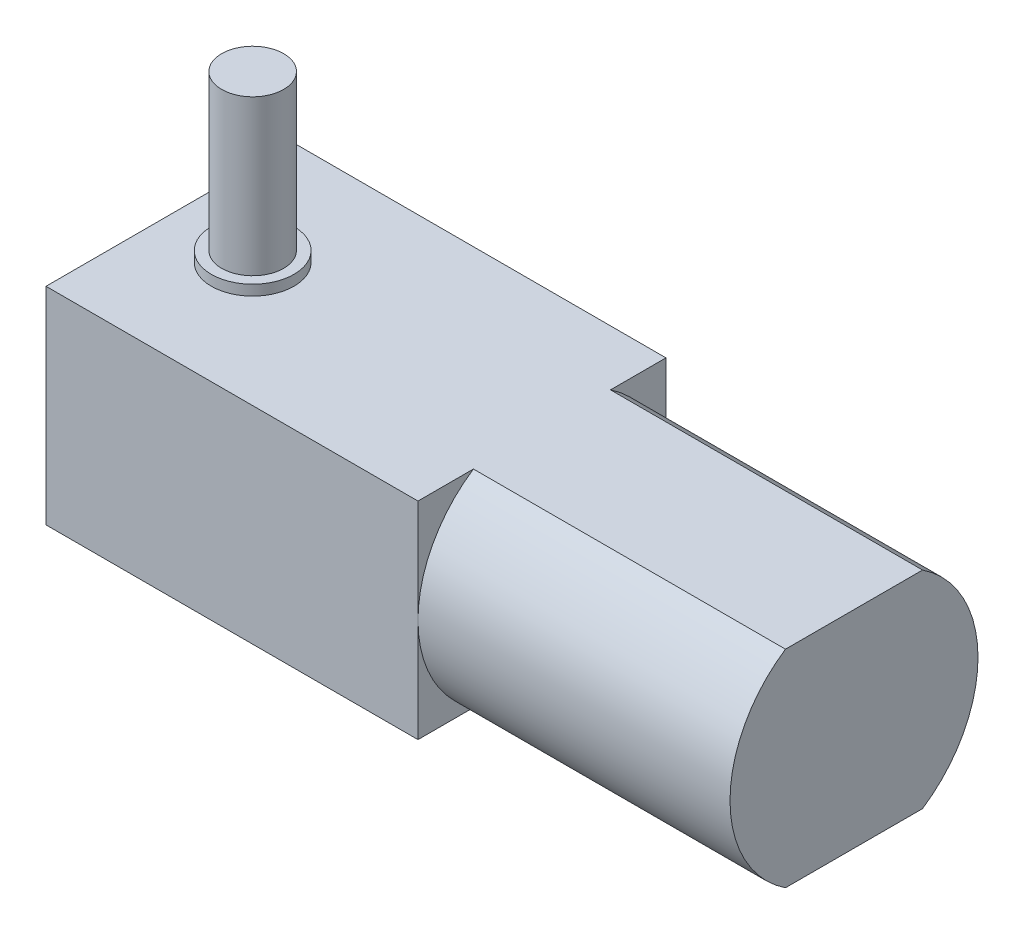
ISO-10303-21;
HEADER;
FILE_DESCRIPTION(('STEP AP214'),'2;1');
FILE_NAME('part.step','',(''),(''),'','','');
FILE_SCHEMA(('AUTOMOTIVE_DESIGN { 1 0 10303 214 1 1 1 1 }'));
ENDSEC;
DATA;
#1=APPLICATION_CONTEXT('core data for automotive mechanical design processes');
#2=APPLICATION_PROTOCOL_DEFINITION('international standard','automotive_design',2000,#1);
#3=PRODUCT_CONTEXT('',#1,'mechanical');
#4=PRODUCT('Part','Part','',(#3));
#5=PRODUCT_RELATED_PRODUCT_CATEGORY('part','',(#4));
#6=PRODUCT_DEFINITION_FORMATION('','',#4);
#7=PRODUCT_DEFINITION_CONTEXT('part definition',#1,'design');
#8=PRODUCT_DEFINITION('design','',#6,#7);
#9=PRODUCT_DEFINITION_SHAPE('','',#8);
#10=(LENGTH_UNIT() NAMED_UNIT(*) SI_UNIT(.MILLI.,.METRE.));
#11=(NAMED_UNIT(*) PLANE_ANGLE_UNIT() SI_UNIT($,.RADIAN.));
#12=(NAMED_UNIT(*) SI_UNIT($,.STERADIAN.) SOLID_ANGLE_UNIT());
#13=UNCERTAINTY_MEASURE_WITH_UNIT(LENGTH_MEASURE(1.E-05),#10,'distance_accuracy_value','');
#14=(GEOMETRIC_REPRESENTATION_CONTEXT(3) GLOBAL_UNCERTAINTY_ASSIGNED_CONTEXT((#13)) GLOBAL_UNIT_ASSIGNED_CONTEXT((#10,
#11,#12)) REPRESENTATION_CONTEXT('',''));
#15=CARTESIAN_POINT('',(0.,0.,0.));
#16=DIRECTION('',(0.,0.,1.));
#17=DIRECTION('',(1.,0.,0.));
#18=AXIS2_PLACEMENT_3D('',#15,#16,#17);
#19=CARTESIAN_POINT('',(15.1,5.,0.));
#20=DIRECTION('',(0.,1.,0.));
#21=DIRECTION('',(0.,0.,1.));
#22=AXIS2_PLACEMENT_3D('',#19,#20,#21);
#23=PLANE('',#22);
#24=DIRECTION('',(-1.,0.,0.));
#25=VECTOR('',#24,1.);
#26=CARTESIAN_POINT('',(15.1,5.,-3.3166247903554));
#27=LINE('',#26,#25);
#28=CARTESIAN_POINT('',(15.1,5.,-3.3166247903554));
#29=VERTEX_POINT('',#28);
#30=CARTESIAN_POINT('',(0.,5.,-3.3166247903554));
#31=VERTEX_POINT('',#30);
#32=EDGE_CURVE('E171',#29,#31,#27,.T.);
#33=ORIENTED_EDGE('',*,*,#32,.T.);
#34=DIRECTION('',(0.,0.,-1.));
#35=VECTOR('',#34,1.);
#36=CARTESIAN_POINT('',(0.,5.,0.));
#37=LINE('',#36,#35);
#38=CARTESIAN_POINT('',(0.,5.,-6.));
#39=VERTEX_POINT('',#38);
#40=EDGE_CURVE('E135',#31,#39,#37,.T.);
#41=ORIENTED_EDGE('',*,*,#40,.T.);
#42=DIRECTION('',(1.,0.,0.));
#43=VECTOR('',#42,1.);
#44=CARTESIAN_POINT('',(-18.,5.,-6.));
#45=LINE('',#44,#43);
#46=CARTESIAN_POINT('',(-18.,5.,-6.));
#47=VERTEX_POINT('',#46);
#48=EDGE_CURVE('E155',#47,#39,#45,.T.);
#49=ORIENTED_EDGE('',*,*,#48,.F.);
#50=DIRECTION('',(0.,0.,-1.));
#51=VECTOR('',#50,1.);
#52=CARTESIAN_POINT('',(-18.,5.,0.));
#53=LINE('',#52,#51);
#54=CARTESIAN_POINT('',(-18.,5.,6.));
#55=VERTEX_POINT('',#54);
#56=EDGE_CURVE('E118',#55,#47,#53,.T.);
#57=ORIENTED_EDGE('',*,*,#56,.F.);
#58=DIRECTION('',(1.,0.,0.));
#59=VECTOR('',#58,1.);
#60=CARTESIAN_POINT('',(-18.,5.,6.));
#61=LINE('',#60,#59);
#62=CARTESIAN_POINT('',(0.,5.,6.));
#63=VERTEX_POINT('',#62);
#64=EDGE_CURVE('E130',#55,#63,#61,.T.);
#65=ORIENTED_EDGE('',*,*,#64,.T.);
#66=CARTESIAN_POINT('',(0.,5.,3.3166247903554));
#67=VERTEX_POINT('',#66);
#68=EDGE_CURVE('E132',#63,#67,#37,.T.);
#69=ORIENTED_EDGE('',*,*,#68,.T.);
#70=DIRECTION('',(-1.,0.,0.));
#71=VECTOR('',#70,1.);
#72=CARTESIAN_POINT('',(15.1,5.,3.3166247903554));
#73=LINE('',#72,#71);
#74=CARTESIAN_POINT('',(15.1,5.,3.3166247903554));
#75=VERTEX_POINT('',#74);
#76=EDGE_CURVE('E11',#75,#67,#73,.T.);
#77=ORIENTED_EDGE('',*,*,#76,.F.);
#78=DIRECTION('',(0.,0.,-1.));
#79=VECTOR('',#78,1.);
#80=CARTESIAN_POINT('',(15.1,5.,0.));
#81=LINE('',#80,#79);
#82=EDGE_CURVE('E159',#75,#29,#81,.T.);
#83=ORIENTED_EDGE('',*,*,#82,.T.);
#84=EDGE_LOOP('',(#33,#41,#49,#57,#65,#69,#77,#83));
#85=FACE_BOUND('',#84,.T.);
#86=CARTESIAN_POINT('',(-14.,5.,0.));
#87=DIRECTION('',(0.,1.,0.));
#88=DIRECTION('',(0.,0.,1.));
#89=AXIS2_PLACEMENT_3D('',#86,#87,#88);
#90=CIRCLE('',#89,2.);
#91=CARTESIAN_POINT('',(-14.,5.,2.));
#92=VERTEX_POINT('',#91);
#93=EDGE_CURVE('E333',#92,#92,#90,.T.);
#94=ORIENTED_EDGE('',*,*,#93,.F.);
#95=EDGE_LOOP('',(#94));
#96=FACE_BOUND('',#95,.T.);
#97=ADVANCED_FACE('F39',(#85,#96),#23,.T.);
#98=CARTESIAN_POINT('',(15.1,0.,0.));
#99=DIRECTION('',(-1.,0.,0.));
#100=DIRECTION('',(0.,0.,1.));
#101=AXIS2_PLACEMENT_3D('',#98,#99,#100);
#102=CYLINDRICAL_SURFACE('',#101,6.);
#103=CARTESIAN_POINT('',(0.,0.,0.));
#104=DIRECTION('',(1.,0.,0.));
#105=DIRECTION('',(0.,0.,-1.));
#106=AXIS2_PLACEMENT_3D('',#103,#104,#105);
#107=CIRCLE('',#106,6.);
#108=CARTESIAN_POINT('',(0.,0.,6.));
#109=VERTEX_POINT('',#108);
#110=EDGE_CURVE('E167',#67,#109,#107,.T.);
#111=ORIENTED_EDGE('',*,*,#110,.T.);
#112=CARTESIAN_POINT('',(0.,-5.,3.3166247903554));
#113=VERTEX_POINT('',#112);
#114=EDGE_CURVE('E154',#109,#113,#107,.T.);
#115=ORIENTED_EDGE('',*,*,#114,.T.);
#116=DIRECTION('',(-1.,0.,0.));
#117=VECTOR('',#116,1.);
#118=CARTESIAN_POINT('',(15.1,-5.,3.3166247903554));
#119=LINE('',#118,#117);
#120=CARTESIAN_POINT('',(15.1,-5.,3.3166247903554));
#121=VERTEX_POINT('',#120);
#122=EDGE_CURVE('E47',#121,#113,#119,.T.);
#123=ORIENTED_EDGE('',*,*,#122,.F.);
#124=CARTESIAN_POINT('',(15.1,0.,0.));
#125=DIRECTION('',(1.,0.,0.));
#126=DIRECTION('',(0.,0.,-1.));
#127=AXIS2_PLACEMENT_3D('',#124,#125,#126);
#128=CIRCLE('',#127,6.);
#129=EDGE_CURVE('E162',#75,#121,#128,.T.);
#130=ORIENTED_EDGE('',*,*,#129,.F.);
#131=ORIENTED_EDGE('',*,*,#76,.T.);
#132=EDGE_LOOP('',(#111,#115,#123,#130,#131));
#133=FACE_BOUND('',#132,.T.);
#134=ADVANCED_FACE('F182',(#133),#102,.T.);
#135=CARTESIAN_POINT('',(15.1,-5.,0.));
#136=DIRECTION('',(0.,1.,0.));
#137=DIRECTION('',(0.,0.,1.));
#138=AXIS2_PLACEMENT_3D('',#135,#136,#137);
#139=PLANE('',#138);
#140=ORIENTED_EDGE('',*,*,#122,.T.);
#141=DIRECTION('',(0.,0.,-1.));
#142=VECTOR('',#141,1.);
#143=CARTESIAN_POINT('',(0.,-5.,0.));
#144=LINE('',#143,#142);
#145=CARTESIAN_POINT('',(0.,-5.,6.));
#146=VERTEX_POINT('',#145);
#147=EDGE_CURVE('E113',#146,#113,#144,.T.);
#148=ORIENTED_EDGE('',*,*,#147,.F.);
#149=DIRECTION('',(1.,0.,0.));
#150=VECTOR('',#149,1.);
#151=CARTESIAN_POINT('',(-18.,-5.,6.));
#152=LINE('',#151,#150);
#153=CARTESIAN_POINT('',(-18.,-5.,6.));
#154=VERTEX_POINT('',#153);
#155=EDGE_CURVE('E106',#154,#146,#152,.T.);
#156=ORIENTED_EDGE('',*,*,#155,.F.);
#157=DIRECTION('',(0.,0.,-1.));
#158=VECTOR('',#157,1.);
#159=CARTESIAN_POINT('',(-18.,-5.,0.));
#160=LINE('',#159,#158);
#161=CARTESIAN_POINT('',(-18.,-5.,-6.));
#162=VERTEX_POINT('',#161);
#163=EDGE_CURVE('E111',#154,#162,#160,.T.);
#164=ORIENTED_EDGE('',*,*,#163,.T.);
#165=DIRECTION('',(1.,0.,0.));
#166=VECTOR('',#165,1.);
#167=CARTESIAN_POINT('',(-18.,-5.,-6.));
#168=LINE('',#167,#166);
#169=CARTESIAN_POINT('',(0.,-5.,-6.));
#170=VERTEX_POINT('',#169);
#171=EDGE_CURVE('E117',#162,#170,#168,.T.);
#172=ORIENTED_EDGE('',*,*,#171,.T.);
#173=CARTESIAN_POINT('',(0.,-5.,-3.3166247903554));
#174=VERTEX_POINT('',#173);
#175=EDGE_CURVE('E146',#174,#170,#144,.T.);
#176=ORIENTED_EDGE('',*,*,#175,.F.);
#177=DIRECTION('',(-1.,0.,0.));
#178=VECTOR('',#177,1.);
#179=CARTESIAN_POINT('',(15.1,-5.,-3.3166247903554));
#180=LINE('',#179,#178);
#181=CARTESIAN_POINT('',(15.1,-5.,-3.3166247903554));
#182=VERTEX_POINT('',#181);
#183=EDGE_CURVE('E174',#182,#174,#180,.T.);
#184=ORIENTED_EDGE('',*,*,#183,.F.);
#185=DIRECTION('',(0.,0.,-1.));
#186=VECTOR('',#185,1.);
#187=CARTESIAN_POINT('',(15.1,-5.,0.));
#188=LINE('',#187,#186);
#189=EDGE_CURVE('E165',#121,#182,#188,.T.);
#190=ORIENTED_EDGE('',*,*,#189,.F.);
#191=EDGE_LOOP('',(#140,#148,#156,#164,#172,#176,#184,#190));
#192=FACE_BOUND('',#191,.T.);
#193=ADVANCED_FACE('F109',(#192),#139,.F.);
#194=CARTESIAN_POINT('',(0.,0.,-6.));
#195=VERTEX_POINT('',#194);
#196=EDGE_CURVE('E163',#174,#195,#107,.T.);
#197=ORIENTED_EDGE('',*,*,#196,.T.);
#198=EDGE_CURVE('E170',#195,#31,#107,.T.);
#199=ORIENTED_EDGE('',*,*,#198,.T.);
#200=ORIENTED_EDGE('',*,*,#32,.F.);
#201=EDGE_CURVE('E54',#182,#29,#128,.T.);
#202=ORIENTED_EDGE('',*,*,#201,.F.);
#203=ORIENTED_EDGE('',*,*,#183,.T.);
#204=EDGE_LOOP('',(#197,#199,#200,#202,#203));
#205=FACE_BOUND('',#204,.T.);
#206=ADVANCED_FACE('F187',(#205),#102,.T.);
#207=CARTESIAN_POINT('',(15.1,0.,0.));
#208=DIRECTION('',(1.,0.,0.));
#209=DIRECTION('',(0.,0.,-1.));
#210=AXIS2_PLACEMENT_3D('',#207,#208,#209);
#211=PLANE('',#210);
#212=ORIENTED_EDGE('',*,*,#82,.F.);
#213=ORIENTED_EDGE('',*,*,#129,.T.);
#214=ORIENTED_EDGE('',*,*,#189,.T.);
#215=ORIENTED_EDGE('',*,*,#201,.T.);
#216=EDGE_LOOP('',(#212,#213,#214,#215));
#217=FACE_BOUND('',#216,.T.);
#218=ADVANCED_FACE('F201',(#217),#211,.T.);
#219=CARTESIAN_POINT('',(0.,0.,0.));
#220=DIRECTION('',(1.,0.,0.));
#221=DIRECTION('',(0.,0.,-1.));
#222=AXIS2_PLACEMENT_3D('',#219,#220,#221);
#223=PLANE('',#222);
#224=ORIENTED_EDGE('',*,*,#196,.F.);
#225=ORIENTED_EDGE('',*,*,#175,.T.);
#226=DIRECTION('',(0.,-1.,0.));
#227=VECTOR('',#226,1.);
#228=CARTESIAN_POINT('',(0.,0.,-6.));
#229=LINE('',#228,#227);
#230=EDGE_CURVE('E149',#195,#170,#229,.T.);
#231=ORIENTED_EDGE('',*,*,#230,.F.);
#232=EDGE_LOOP('',(#224,#225,#231));
#233=FACE_BOUND('',#232,.T.);
#234=ADVANCED_FACE('F192',(#233),#223,.T.);
#235=ORIENTED_EDGE('',*,*,#198,.F.);
#236=EDGE_CURVE('E150',#39,#195,#229,.T.);
#237=ORIENTED_EDGE('',*,*,#236,.F.);
#238=ORIENTED_EDGE('',*,*,#40,.F.);
#239=EDGE_LOOP('',(#235,#237,#238));
#240=FACE_BOUND('',#239,.T.);
#241=ADVANCED_FACE('F198',(#240),#223,.T.);
#242=ORIENTED_EDGE('',*,*,#110,.F.);
#243=ORIENTED_EDGE('',*,*,#68,.F.);
#244=DIRECTION('',(0.,-1.,0.));
#245=VECTOR('',#244,1.);
#246=CARTESIAN_POINT('',(0.,0.,6.));
#247=LINE('',#246,#245);
#248=EDGE_CURVE('E143',#63,#109,#247,.T.);
#249=ORIENTED_EDGE('',*,*,#248,.T.);
#250=EDGE_LOOP('',(#242,#243,#249));
#251=FACE_BOUND('',#250,.T.);
#252=ADVANCED_FACE('F242',(#251),#223,.T.);
#253=ORIENTED_EDGE('',*,*,#114,.F.);
#254=EDGE_CURVE('E147',#109,#146,#247,.T.);
#255=ORIENTED_EDGE('',*,*,#254,.T.);
#256=ORIENTED_EDGE('',*,*,#147,.T.);
#257=EDGE_LOOP('',(#253,#255,#256));
#258=FACE_BOUND('',#257,.T.);
#259=ADVANCED_FACE('F209',(#258),#223,.T.);
#260=CARTESIAN_POINT('',(-18.,0.,6.));
#261=DIRECTION('',(0.,0.,1.));
#262=DIRECTION('',(1.,0.,0.));
#263=AXIS2_PLACEMENT_3D('',#260,#261,#262);
#264=PLANE('',#263);
#265=ORIENTED_EDGE('',*,*,#248,.F.);
#266=ORIENTED_EDGE('',*,*,#64,.F.);
#267=DIRECTION('',(0.,-1.,0.));
#268=VECTOR('',#267,1.);
#269=CARTESIAN_POINT('',(-18.,0.,6.));
#270=LINE('',#269,#268);
#271=EDGE_CURVE('E123',#55,#154,#270,.T.);
#272=ORIENTED_EDGE('',*,*,#271,.T.);
#273=ORIENTED_EDGE('',*,*,#155,.T.);
#274=ORIENTED_EDGE('',*,*,#254,.F.);
#275=EDGE_LOOP('',(#265,#266,#272,#273,#274));
#276=FACE_BOUND('',#275,.T.);
#277=ADVANCED_FACE('F129',(#276),#264,.T.);
#278=CARTESIAN_POINT('',(-18.,0.,-6.));
#279=DIRECTION('',(0.,0.,1.));
#280=DIRECTION('',(1.,0.,0.));
#281=AXIS2_PLACEMENT_3D('',#278,#279,#280);
#282=PLANE('',#281);
#283=ORIENTED_EDGE('',*,*,#236,.T.);
#284=ORIENTED_EDGE('',*,*,#230,.T.);
#285=ORIENTED_EDGE('',*,*,#171,.F.);
#286=DIRECTION('',(0.,-1.,0.));
#287=VECTOR('',#286,1.);
#288=CARTESIAN_POINT('',(-18.,0.,-6.));
#289=LINE('',#288,#287);
#290=EDGE_CURVE('E125',#47,#162,#289,.T.);
#291=ORIENTED_EDGE('',*,*,#290,.F.);
#292=ORIENTED_EDGE('',*,*,#48,.T.);
#293=EDGE_LOOP('',(#283,#284,#285,#291,#292));
#294=FACE_BOUND('',#293,.T.);
#295=ADVANCED_FACE('F194',(#294),#282,.F.);
#296=CARTESIAN_POINT('',(-18.,0.,0.));
#297=DIRECTION('',(1.,0.,0.));
#298=DIRECTION('',(0.,0.,-1.));
#299=AXIS2_PLACEMENT_3D('',#296,#297,#298);
#300=PLANE('',#299);
#301=ORIENTED_EDGE('',*,*,#271,.F.);
#302=ORIENTED_EDGE('',*,*,#56,.T.);
#303=ORIENTED_EDGE('',*,*,#290,.T.);
#304=ORIENTED_EDGE('',*,*,#163,.F.);
#305=EDGE_LOOP('',(#301,#302,#303,#304));
#306=FACE_BOUND('',#305,.T.);
#307=ADVANCED_FACE('F122',(#306),#300,.F.);
#308=CARTESIAN_POINT('',(-14.,5.5,0.));
#309=DIRECTION('',(0.,1.,0.));
#310=DIRECTION('',(0.,0.,1.));
#311=AXIS2_PLACEMENT_3D('',#308,#309,#310);
#312=PLANE('',#311);
#313=CARTESIAN_POINT('',(-14.,5.5,0.));
#314=DIRECTION('',(0.,1.,0.));
#315=DIRECTION('',(0.,0.,1.));
#316=AXIS2_PLACEMENT_3D('',#313,#314,#315);
#317=CIRCLE('',#316,2.);
#318=CARTESIAN_POINT('',(-14.,5.5,2.));
#319=VERTEX_POINT('',#318);
#320=EDGE_CURVE('E331',#319,#319,#317,.T.);
#321=ORIENTED_EDGE('',*,*,#320,.T.);
#322=EDGE_LOOP('',(#321));
#323=FACE_BOUND('',#322,.T.);
#324=CARTESIAN_POINT('',(-14.,5.5,0.));
#325=DIRECTION('',(0.,1.,0.));
#326=DIRECTION('',(0.,0.,1.));
#327=AXIS2_PLACEMENT_3D('',#324,#325,#326);
#328=CIRCLE('',#327,1.5);
#329=CARTESIAN_POINT('',(-14.,5.5,1.5));
#330=VERTEX_POINT('',#329);
#331=EDGE_CURVE('E328',#330,#330,#328,.T.);
#332=ORIENTED_EDGE('',*,*,#331,.F.);
#333=EDGE_LOOP('',(#332));
#334=FACE_BOUND('',#333,.T.);
#335=ADVANCED_FACE('F277',(#323,#334),#312,.T.);
#336=CARTESIAN_POINT('',(-14.,5.5,0.));
#337=DIRECTION('',(0.,-1.,0.));
#338=DIRECTION('',(0.,0.,-1.));
#339=AXIS2_PLACEMENT_3D('',#336,#337,#338);
#340=CYLINDRICAL_SURFACE('',#339,2.);
#341=ORIENTED_EDGE('',*,*,#320,.F.);
#342=EDGE_LOOP('',(#341));
#343=FACE_BOUND('',#342,.T.);
#344=ORIENTED_EDGE('',*,*,#93,.T.);
#345=EDGE_LOOP('',(#344));
#346=FACE_BOUND('',#345,.T.);
#347=ADVANCED_FACE('F287',(#343,#346),#340,.T.);
#348=CARTESIAN_POINT('',(-14.,13.,0.));
#349=DIRECTION('',(0.,1.,0.));
#350=DIRECTION('',(0.,0.,1.));
#351=AXIS2_PLACEMENT_3D('',#348,#349,#350);
#352=PLANE('',#351);
#353=CARTESIAN_POINT('',(-14.,13.,0.));
#354=DIRECTION('',(0.,1.,0.));
#355=DIRECTION('',(0.,0.,1.));
#356=AXIS2_PLACEMENT_3D('',#353,#354,#355);
#357=CIRCLE('',#356,1.5);
#358=CARTESIAN_POINT('',(-14.,13.,1.5));
#359=VERTEX_POINT('',#358);
#360=EDGE_CURVE('E138',#359,#359,#357,.T.);
#361=ORIENTED_EDGE('',*,*,#360,.T.);
#362=EDGE_LOOP('',(#361));
#363=FACE_BOUND('',#362,.T.);
#364=ADVANCED_FACE('F283',(#363),#352,.T.);
#365=CARTESIAN_POINT('',(-14.,13.,0.));
#366=DIRECTION('',(0.,-1.,0.));
#367=DIRECTION('',(0.,0.,-1.));
#368=AXIS2_PLACEMENT_3D('',#365,#366,#367);
#369=CYLINDRICAL_SURFACE('',#368,1.5);
#370=ORIENTED_EDGE('',*,*,#331,.T.);
#371=EDGE_LOOP('',(#370));
#372=FACE_BOUND('',#371,.T.);
#373=ORIENTED_EDGE('',*,*,#360,.F.);
#374=EDGE_LOOP('',(#373));
#375=FACE_BOUND('',#374,.T.);
#376=ADVANCED_FACE('F286',(#372,#375),#369,.T.);
#377=CLOSED_SHELL('',(#97,#134,#193,#206,#218,#234,#241,#252,#259,#277,#295,#307,#335,#347,#364,#376));
#378=MANIFOLD_SOLID_BREP('B2',#377);
#379=ADVANCED_BREP_SHAPE_REPRESENTATION('',(#18,#378),#14);
#380=SHAPE_DEFINITION_REPRESENTATION(#9,#379);
ENDSEC;
END-ISO-10303-21;
